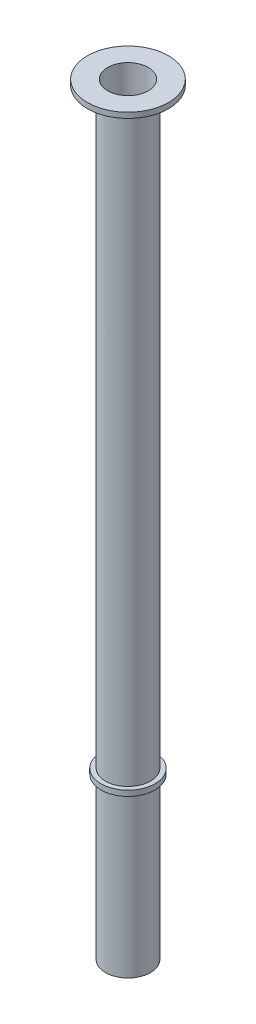
ISO-10303-21;
HEADER;
FILE_DESCRIPTION(('STEP AP214'),'2;1');
FILE_NAME('part.step','',(''),(''),'','','');
FILE_SCHEMA(('AUTOMOTIVE_DESIGN { 1 0 10303 214 1 1 1 1 }'));
ENDSEC;
DATA;
#1=APPLICATION_CONTEXT('core data for automotive mechanical design processes');
#2=APPLICATION_PROTOCOL_DEFINITION('international standard','automotive_design',2000,#1);
#3=PRODUCT_CONTEXT('',#1,'mechanical');
#4=PRODUCT('Part','Part','',(#3));
#5=PRODUCT_RELATED_PRODUCT_CATEGORY('part','',(#4));
#6=PRODUCT_DEFINITION_FORMATION('','',#4);
#7=PRODUCT_DEFINITION_CONTEXT('part definition',#1,'design');
#8=PRODUCT_DEFINITION('design','',#6,#7);
#9=PRODUCT_DEFINITION_SHAPE('','',#8);
#10=(LENGTH_UNIT() NAMED_UNIT(*) SI_UNIT(.MILLI.,.METRE.));
#11=(NAMED_UNIT(*) PLANE_ANGLE_UNIT() SI_UNIT($,.RADIAN.));
#12=(NAMED_UNIT(*) SI_UNIT($,.STERADIAN.) SOLID_ANGLE_UNIT());
#13=UNCERTAINTY_MEASURE_WITH_UNIT(LENGTH_MEASURE(1.E-05),#10,'distance_accuracy_value','');
#14=(GEOMETRIC_REPRESENTATION_CONTEXT(3) GLOBAL_UNCERTAINTY_ASSIGNED_CONTEXT((#13)) GLOBAL_UNIT_ASSIGNED_CONTEXT((#10,
#11,#12)) REPRESENTATION_CONTEXT('',''));
#15=CARTESIAN_POINT('',(0.,0.,0.));
#16=DIRECTION('',(0.,0.,1.));
#17=DIRECTION('',(1.,0.,0.));
#18=AXIS2_PLACEMENT_3D('',#15,#16,#17);
#19=CARTESIAN_POINT('',(0.,210.,0.));
#20=DIRECTION('',(0.,-1.,0.));
#21=DIRECTION('',(0.,0.,-1.));
#22=AXIS2_PLACEMENT_3D('',#19,#20,#21);
#23=CYLINDRICAL_SURFACE('',#22,12.5);
#24=CARTESIAN_POINT('',(0.,210.,0.));
#25=DIRECTION('',(0.,1.,0.));
#26=DIRECTION('',(0.,0.,1.));
#27=AXIS2_PLACEMENT_3D('',#24,#25,#26);
#28=CIRCLE('',#27,12.5);
#29=CARTESIAN_POINT('',(0.,210.,12.5));
#30=VERTEX_POINT('',#29);
#31=EDGE_CURVE('E40',#30,#30,#28,.T.);
#32=ORIENTED_EDGE('',*,*,#31,.F.);
#33=EDGE_LOOP('',(#32));
#34=FACE_BOUND('',#33,.T.);
#35=CARTESIAN_POINT('',(0.,-118.,0.));
#36=DIRECTION('',(0.,-1.,0.));
#37=DIRECTION('',(0.,0.,-1.));
#38=AXIS2_PLACEMENT_3D('',#35,#36,#37);
#39=CIRCLE('',#38,12.5);
#40=CARTESIAN_POINT('',(0.,-118.,-12.5));
#41=VERTEX_POINT('',#40);
#42=EDGE_CURVE('E10',#41,#41,#39,.T.);
#43=ORIENTED_EDGE('',*,*,#42,.F.);
#44=EDGE_LOOP('',(#43));
#45=FACE_BOUND('',#44,.T.);
#46=ADVANCED_FACE('F32',(#34,#45),#23,.T.);
#47=CARTESIAN_POINT('',(0.,-210.,0.));
#48=DIRECTION('',(0.,1.,0.));
#49=DIRECTION('',(0.,0.,1.));
#50=AXIS2_PLACEMENT_3D('',#47,#48,#49);
#51=PLANE('',#50);
#52=CARTESIAN_POINT('',(0.,-210.,0.));
#53=DIRECTION('',(0.,1.,0.));
#54=DIRECTION('',(0.,0.,1.));
#55=AXIS2_PLACEMENT_3D('',#52,#53,#54);
#56=CIRCLE('',#55,12.5);
#57=CARTESIAN_POINT('',(0.,-210.,12.5));
#58=VERTEX_POINT('',#57);
#59=EDGE_CURVE('E36',#58,#58,#56,.T.);
#60=ORIENTED_EDGE('',*,*,#59,.F.);
#61=EDGE_LOOP('',(#60));
#62=FACE_BOUND('',#61,.T.);
#63=CARTESIAN_POINT('',(0.,-210.,0.));
#64=DIRECTION('',(0.,1.,0.));
#65=DIRECTION('',(0.,0.,1.));
#66=AXIS2_PLACEMENT_3D('',#63,#64,#65);
#67=CIRCLE('',#66,11.25);
#68=CARTESIAN_POINT('',(0.,-210.,11.25));
#69=VERTEX_POINT('',#68);
#70=EDGE_CURVE('E60',#69,#69,#67,.T.);
#71=ORIENTED_EDGE('',*,*,#70,.T.);
#72=EDGE_LOOP('',(#71));
#73=FACE_BOUND('',#72,.T.);
#74=ADVANCED_FACE('F70',(#62,#73),#51,.F.);
#75=CARTESIAN_POINT('',(0.,-121.,0.));
#76=DIRECTION('',(0.,-1.,0.));
#77=DIRECTION('',(0.,0.,-1.));
#78=AXIS2_PLACEMENT_3D('',#75,#76,#77);
#79=CIRCLE('',#78,12.5);
#80=CARTESIAN_POINT('',(0.,-121.,-12.5));
#81=VERTEX_POINT('',#80);
#82=EDGE_CURVE('E49',#81,#81,#79,.T.);
#83=ORIENTED_EDGE('',*,*,#82,.T.);
#84=EDGE_LOOP('',(#83));
#85=FACE_BOUND('',#84,.T.);
#86=ORIENTED_EDGE('',*,*,#59,.T.);
#87=EDGE_LOOP('',(#86));
#88=FACE_BOUND('',#87,.T.);
#89=ADVANCED_FACE('F34',(#85,#88),#23,.T.);
#90=CARTESIAN_POINT('',(0.,210.,0.));
#91=DIRECTION('',(0.,-1.,0.));
#92=DIRECTION('',(0.,0.,-1.));
#93=AXIS2_PLACEMENT_3D('',#90,#91,#92);
#94=CYLINDRICAL_SURFACE('',#93,11.25);
#95=ORIENTED_EDGE('',*,*,#70,.F.);
#96=EDGE_LOOP('',(#95));
#97=FACE_BOUND('',#96,.T.);
#98=CARTESIAN_POINT('',(0.,213.,0.));
#99=DIRECTION('',(0.,1.,0.));
#100=DIRECTION('',(0.,0.,1.));
#101=AXIS2_PLACEMENT_3D('',#98,#99,#100);
#102=CIRCLE('',#101,11.25);
#103=CARTESIAN_POINT('',(0.,213.,11.25));
#104=VERTEX_POINT('',#103);
#105=EDGE_CURVE('E52',#104,#104,#102,.T.);
#106=ORIENTED_EDGE('',*,*,#105,.T.);
#107=EDGE_LOOP('',(#106));
#108=FACE_BOUND('',#107,.T.);
#109=ADVANCED_FACE('F76',(#97,#108),#94,.F.);
#110=CARTESIAN_POINT('',(0.,213.,0.));
#111=DIRECTION('',(0.,1.,0.));
#112=DIRECTION('',(0.,0.,1.));
#113=AXIS2_PLACEMENT_3D('',#110,#111,#112);
#114=PLANE('',#113);
#115=CARTESIAN_POINT('',(0.,213.,0.));
#116=DIRECTION('',(0.,1.,0.));
#117=DIRECTION('',(0.,0.,1.));
#118=AXIS2_PLACEMENT_3D('',#115,#116,#117);
#119=CIRCLE('',#118,22.5);
#120=CARTESIAN_POINT('',(0.,213.,22.5));
#121=VERTEX_POINT('',#120);
#122=EDGE_CURVE('E57',#121,#121,#119,.T.);
#123=ORIENTED_EDGE('',*,*,#122,.T.);
#124=EDGE_LOOP('',(#123));
#125=FACE_BOUND('',#124,.T.);
#126=ORIENTED_EDGE('',*,*,#105,.F.);
#127=EDGE_LOOP('',(#126));
#128=FACE_BOUND('',#127,.T.);
#129=ADVANCED_FACE('F82',(#125,#128),#114,.T.);
#130=CARTESIAN_POINT('',(0.,210.,0.));
#131=DIRECTION('',(0.,1.,0.));
#132=DIRECTION('',(0.,0.,1.));
#133=AXIS2_PLACEMENT_3D('',#130,#131,#132);
#134=PLANE('',#133);
#135=ORIENTED_EDGE('',*,*,#31,.T.);
#136=EDGE_LOOP('',(#135));
#137=FACE_BOUND('',#136,.T.);
#138=CARTESIAN_POINT('',(0.,210.,0.));
#139=DIRECTION('',(0.,1.,0.));
#140=DIRECTION('',(0.,0.,1.));
#141=AXIS2_PLACEMENT_3D('',#138,#139,#140);
#142=CIRCLE('',#141,22.5);
#143=CARTESIAN_POINT('',(0.,210.,22.5));
#144=VERTEX_POINT('',#143);
#145=EDGE_CURVE('E56',#144,#144,#142,.T.);
#146=ORIENTED_EDGE('',*,*,#145,.F.);
#147=EDGE_LOOP('',(#146));
#148=FACE_BOUND('',#147,.T.);
#149=ADVANCED_FACE('F88',(#137,#148),#134,.F.);
#150=CARTESIAN_POINT('',(0.,213.,0.));
#151=DIRECTION('',(0.,-1.,0.));
#152=DIRECTION('',(0.,0.,-1.));
#153=AXIS2_PLACEMENT_3D('',#150,#151,#152);
#154=CYLINDRICAL_SURFACE('',#153,22.5);
#155=ORIENTED_EDGE('',*,*,#122,.F.);
#156=EDGE_LOOP('',(#155));
#157=FACE_BOUND('',#156,.T.);
#158=ORIENTED_EDGE('',*,*,#145,.T.);
#159=EDGE_LOOP('',(#158));
#160=FACE_BOUND('',#159,.T.);
#161=ADVANCED_FACE('F84',(#157,#160),#154,.T.);
#162=CARTESIAN_POINT('',(0.,-121.,0.));
#163=DIRECTION('',(0.,-1.,0.));
#164=DIRECTION('',(0.,0.,-1.));
#165=AXIS2_PLACEMENT_3D('',#162,#163,#164);
#166=PLANE('',#165);
#167=CARTESIAN_POINT('',(0.,-121.,0.));
#168=DIRECTION('',(0.,-1.,0.));
#169=DIRECTION('',(0.,0.,-1.));
#170=AXIS2_PLACEMENT_3D('',#167,#168,#169);
#171=CIRCLE('',#170,15.);
#172=CARTESIAN_POINT('',(0.,-121.,-15.));
#173=VERTEX_POINT('',#172);
#174=EDGE_CURVE('E53',#173,#173,#171,.T.);
#175=ORIENTED_EDGE('',*,*,#174,.T.);
#176=EDGE_LOOP('',(#175));
#177=FACE_BOUND('',#176,.T.);
#178=ORIENTED_EDGE('',*,*,#82,.F.);
#179=EDGE_LOOP('',(#178));
#180=FACE_BOUND('',#179,.T.);
#181=ADVANCED_FACE('F87',(#177,#180),#166,.T.);
#182=CARTESIAN_POINT('',(0.,-118.,0.));
#183=DIRECTION('',(0.,-1.,0.));
#184=DIRECTION('',(0.,0.,-1.));
#185=AXIS2_PLACEMENT_3D('',#182,#183,#184);
#186=PLANE('',#185);
#187=CARTESIAN_POINT('',(0.,-118.,0.));
#188=DIRECTION('',(0.,-1.,0.));
#189=DIRECTION('',(0.,0.,-1.));
#190=AXIS2_PLACEMENT_3D('',#187,#188,#189);
#191=CIRCLE('',#190,15.);
#192=CARTESIAN_POINT('',(0.,-118.,-15.));
#193=VERTEX_POINT('',#192);
#194=EDGE_CURVE('E47',#193,#193,#191,.T.);
#195=ORIENTED_EDGE('',*,*,#194,.F.);
#196=EDGE_LOOP('',(#195));
#197=FACE_BOUND('',#196,.T.);
#198=ORIENTED_EDGE('',*,*,#42,.T.);
#199=EDGE_LOOP('',(#198));
#200=FACE_BOUND('',#199,.T.);
#201=ADVANCED_FACE('F99',(#197,#200),#186,.F.);
#202=CARTESIAN_POINT('',(0.,-121.,0.));
#203=DIRECTION('',(0.,1.,0.));
#204=DIRECTION('',(0.,0.,1.));
#205=AXIS2_PLACEMENT_3D('',#202,#203,#204);
#206=CYLINDRICAL_SURFACE('',#205,15.);
#207=ORIENTED_EDGE('',*,*,#174,.F.);
#208=EDGE_LOOP('',(#207));
#209=FACE_BOUND('',#208,.T.);
#210=ORIENTED_EDGE('',*,*,#194,.T.);
#211=EDGE_LOOP('',(#210));
#212=FACE_BOUND('',#211,.T.);
#213=ADVANCED_FACE('F96',(#209,#212),#206,.T.);
#214=CLOSED_SHELL('',(#46,#74,#89,#109,#129,#149,#161,#181,#201,#213));
#215=MANIFOLD_SOLID_BREP('B2',#214);
#216=ADVANCED_BREP_SHAPE_REPRESENTATION('',(#18,#215),#14);
#217=SHAPE_DEFINITION_REPRESENTATION(#9,#216);
ENDSEC;
END-ISO-10303-21;
